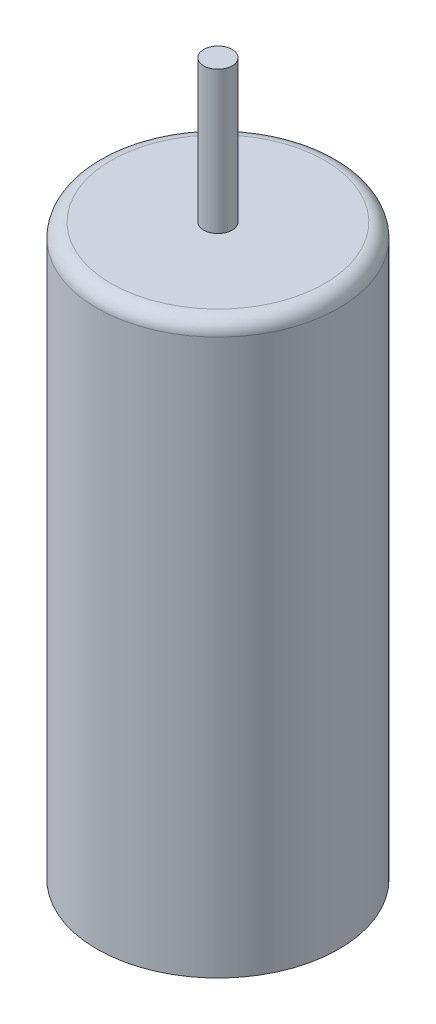
ISO-10303-21;
HEADER;
FILE_DESCRIPTION(('STEP AP214'),'2;1');
FILE_NAME('part.step','',(''),(''),'','','');
FILE_SCHEMA(('AUTOMOTIVE_DESIGN { 1 0 10303 214 1 1 1 1 }'));
ENDSEC;
DATA;
#1=APPLICATION_CONTEXT('core data for automotive mechanical design processes');
#2=APPLICATION_PROTOCOL_DEFINITION('international standard','automotive_design',2000,#1);
#3=PRODUCT_CONTEXT('',#1,'mechanical');
#4=PRODUCT('Part','Part','',(#3));
#5=PRODUCT_RELATED_PRODUCT_CATEGORY('part','',(#4));
#6=PRODUCT_DEFINITION_FORMATION('','',#4);
#7=PRODUCT_DEFINITION_CONTEXT('part definition',#1,'design');
#8=PRODUCT_DEFINITION('design','',#6,#7);
#9=PRODUCT_DEFINITION_SHAPE('','',#8);
#10=(LENGTH_UNIT() NAMED_UNIT(*) SI_UNIT(.MILLI.,.METRE.));
#11=(NAMED_UNIT(*) PLANE_ANGLE_UNIT() SI_UNIT($,.RADIAN.));
#12=(NAMED_UNIT(*) SI_UNIT($,.STERADIAN.) SOLID_ANGLE_UNIT());
#13=UNCERTAINTY_MEASURE_WITH_UNIT(LENGTH_MEASURE(1.E-05),#10,'distance_accuracy_value','');
#14=(GEOMETRIC_REPRESENTATION_CONTEXT(3) GLOBAL_UNCERTAINTY_ASSIGNED_CONTEXT((#13)) GLOBAL_UNIT_ASSIGNED_CONTEXT((#10,
#11,#12)) REPRESENTATION_CONTEXT('',''));
#15=CARTESIAN_POINT('',(0.,0.,0.));
#16=DIRECTION('',(0.,0.,1.));
#17=DIRECTION('',(1.,0.,0.));
#18=AXIS2_PLACEMENT_3D('',#15,#16,#17);
#19=CARTESIAN_POINT('',(0.,20.,0.));
#20=DIRECTION('',(0.,-1.,0.));
#21=DIRECTION('',(0.,0.,-1.));
#22=AXIS2_PLACEMENT_3D('',#19,#20,#21);
#23=CYLINDRICAL_SURFACE('',#22,4.25);
#24=CARTESIAN_POINT('',(0.,19.5,0.));
#25=DIRECTION('',(0.,1.,0.));
#26=DIRECTION('',(0.,0.,1.));
#27=AXIS2_PLACEMENT_3D('',#24,#25,#26);
#28=CIRCLE('',#27,4.25);
#29=CARTESIAN_POINT('',(0.,19.5,4.25));
#30=VERTEX_POINT('',#29);
#31=EDGE_CURVE('E10',#30,#30,#28,.F.);
#32=ORIENTED_EDGE('',*,*,#31,.T.);
#33=EDGE_LOOP('',(#32));
#34=FACE_BOUND('',#33,.T.);
#35=CARTESIAN_POINT('',(0.,0.,0.));
#36=DIRECTION('',(0.,1.,0.));
#37=DIRECTION('',(0.,0.,1.));
#38=AXIS2_PLACEMENT_3D('',#35,#36,#37);
#39=CIRCLE('',#38,4.25);
#40=CARTESIAN_POINT('',(0.,0.,4.25));
#41=VERTEX_POINT('',#40);
#42=EDGE_CURVE('E46',#41,#41,#39,.T.);
#43=ORIENTED_EDGE('',*,*,#42,.T.);
#44=EDGE_LOOP('',(#43));
#45=FACE_BOUND('',#44,.T.);
#46=ADVANCED_FACE('F35',(#34,#45),#23,.T.);
#47=CARTESIAN_POINT('',(0.,20.,0.));
#48=DIRECTION('',(0.,1.,0.));
#49=DIRECTION('',(0.,0.,1.));
#50=AXIS2_PLACEMENT_3D('',#47,#48,#49);
#51=PLANE('',#50);
#52=CARTESIAN_POINT('',(0.,20.,0.));
#53=DIRECTION('',(0.,1.,0.));
#54=DIRECTION('',(0.,0.,1.));
#55=AXIS2_PLACEMENT_3D('',#52,#53,#54);
#56=CIRCLE('',#55,0.5);
#57=CARTESIAN_POINT('',(0.,20.,0.5));
#58=VERTEX_POINT('',#57);
#59=EDGE_CURVE('E53',#58,#58,#56,.T.);
#60=ORIENTED_EDGE('',*,*,#59,.F.);
#61=EDGE_LOOP('',(#60));
#62=FACE_BOUND('',#61,.T.);
#63=CARTESIAN_POINT('',(0.,20.,0.));
#64=DIRECTION('',(0.,1.,0.));
#65=DIRECTION('',(0.,0.,1.));
#66=AXIS2_PLACEMENT_3D('',#63,#64,#65);
#67=CIRCLE('',#66,3.75);
#68=CARTESIAN_POINT('',(0.,20.,3.75));
#69=VERTEX_POINT('',#68);
#70=EDGE_CURVE('E42',#69,#69,#67,.T.);
#71=ORIENTED_EDGE('',*,*,#70,.T.);
#72=EDGE_LOOP('',(#71));
#73=FACE_BOUND('',#72,.T.);
#74=ADVANCED_FACE('F67',(#62,#73),#51,.T.);
#75=CARTESIAN_POINT('',(0.,0.,0.));
#76=DIRECTION('',(0.,1.,0.));
#77=DIRECTION('',(0.,0.,1.));
#78=AXIS2_PLACEMENT_3D('',#75,#76,#77);
#79=PLANE('',#78);
#80=ORIENTED_EDGE('',*,*,#42,.F.);
#81=EDGE_LOOP('',(#80));
#82=FACE_BOUND('',#81,.T.);
#83=ADVANCED_FACE('F69',(#82),#79,.F.);
#84=CARTESIAN_POINT('',(0.,19.5,0.));
#85=DIRECTION('',(0.,1.,0.));
#86=DIRECTION('',(0.,0.,1.));
#87=AXIS2_PLACEMENT_3D('',#84,#85,#86);
#88=TOROIDAL_SURFACE('',#87,3.75,0.5);
#89=ORIENTED_EDGE('',*,*,#31,.F.);
#90=EDGE_LOOP('',(#89));
#91=FACE_BOUND('',#90,.T.);
#92=ORIENTED_EDGE('',*,*,#70,.F.);
#93=EDGE_LOOP('',(#92));
#94=FACE_BOUND('',#93,.T.);
#95=ADVANCED_FACE('F37',(#91,#94),#88,.T.);
#96=CARTESIAN_POINT('',(0.,25.,0.));
#97=DIRECTION('',(0.,-1.,0.));
#98=DIRECTION('',(0.,0.,-1.));
#99=AXIS2_PLACEMENT_3D('',#96,#97,#98);
#100=CYLINDRICAL_SURFACE('',#99,0.5);
#101=CARTESIAN_POINT('',(0.,25.,0.));
#102=DIRECTION('',(0.,1.,0.));
#103=DIRECTION('',(0.,0.,1.));
#104=AXIS2_PLACEMENT_3D('',#101,#102,#103);
#105=CIRCLE('',#104,0.5);
#106=CARTESIAN_POINT('',(0.,25.,0.5));
#107=VERTEX_POINT('',#106);
#108=EDGE_CURVE('E50',#107,#107,#105,.T.);
#109=ORIENTED_EDGE('',*,*,#108,.F.);
#110=EDGE_LOOP('',(#109));
#111=FACE_BOUND('',#110,.T.);
#112=ORIENTED_EDGE('',*,*,#59,.T.);
#113=EDGE_LOOP('',(#112));
#114=FACE_BOUND('',#113,.T.);
#115=ADVANCED_FACE('F61',(#111,#114),#100,.T.);
#116=CARTESIAN_POINT('',(0.,25.,0.));
#117=DIRECTION('',(0.,1.,0.));
#118=DIRECTION('',(0.,0.,1.));
#119=AXIS2_PLACEMENT_3D('',#116,#117,#118);
#120=PLANE('',#119);
#121=ORIENTED_EDGE('',*,*,#108,.T.);
#122=EDGE_LOOP('',(#121));
#123=FACE_BOUND('',#122,.T.);
#124=ADVANCED_FACE('F59',(#123),#120,.T.);
#125=CLOSED_SHELL('',(#46,#74,#83,#95,#115,#124));
#126=MANIFOLD_SOLID_BREP('B2',#125);
#127=ADVANCED_BREP_SHAPE_REPRESENTATION('',(#18,#126),#14);
#128=SHAPE_DEFINITION_REPRESENTATION(#9,#127);
ENDSEC;
END-ISO-10303-21;
